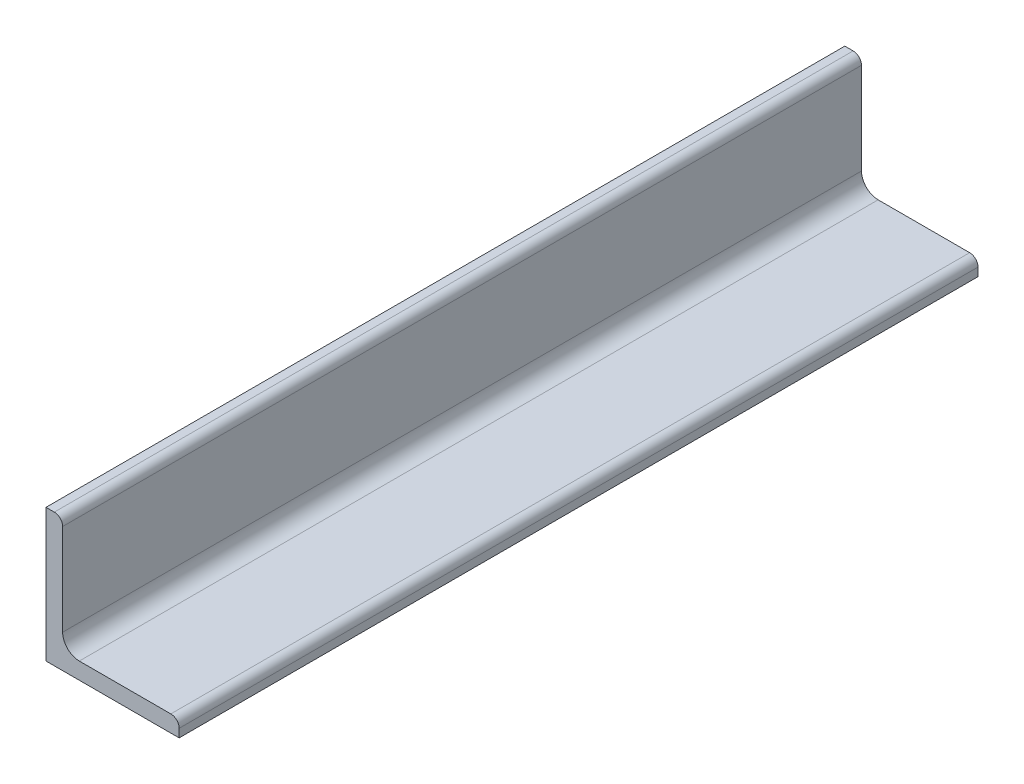
ISO-10303-21;
HEADER;
FILE_DESCRIPTION(('STEP AP214'),'2;1');
FILE_NAME('part.step','',(''),(''),'','','');
FILE_SCHEMA(('AUTOMOTIVE_DESIGN { 1 0 10303 214 1 1 1 1 }'));
ENDSEC;
DATA;
#1=APPLICATION_CONTEXT('core data for automotive mechanical design processes');
#2=APPLICATION_PROTOCOL_DEFINITION('international standard','automotive_design',2000,#1);
#3=PRODUCT_CONTEXT('',#1,'mechanical');
#4=PRODUCT('Part','Part','',(#3));
#5=PRODUCT_RELATED_PRODUCT_CATEGORY('part','',(#4));
#6=PRODUCT_DEFINITION_FORMATION('','',#4);
#7=PRODUCT_DEFINITION_CONTEXT('part definition',#1,'design');
#8=PRODUCT_DEFINITION('design','',#6,#7);
#9=PRODUCT_DEFINITION_SHAPE('','',#8);
#10=(LENGTH_UNIT() NAMED_UNIT(*) SI_UNIT(.MILLI.,.METRE.));
#11=(NAMED_UNIT(*) PLANE_ANGLE_UNIT() SI_UNIT($,.RADIAN.));
#12=(NAMED_UNIT(*) SI_UNIT($,.STERADIAN.) SOLID_ANGLE_UNIT());
#13=UNCERTAINTY_MEASURE_WITH_UNIT(LENGTH_MEASURE(1.E-05),#10,'distance_accuracy_value','');
#14=(GEOMETRIC_REPRESENTATION_CONTEXT(3) GLOBAL_UNCERTAINTY_ASSIGNED_CONTEXT((#13)) GLOBAL_UNIT_ASSIGNED_CONTEXT((#10,
#11,#12)) REPRESENTATION_CONTEXT('',''));
#15=CARTESIAN_POINT('',(0.,0.,0.));
#16=DIRECTION('',(0.,0.,1.));
#17=DIRECTION('',(1.,0.,0.));
#18=AXIS2_PLACEMENT_3D('',#15,#16,#17);
#19=CARTESIAN_POINT('',(0.116507760447575,51.418609434565,304.8));
#20=DIRECTION('',(1.,0.,0.));
#21=DIRECTION('',(0.,0.,-1.));
#22=AXIS2_PLACEMENT_3D('',#19,#20,#21);
#23=PLANE('',#22);
#24=DIRECTION('',(0.,-1.,0.));
#25=VECTOR('',#24,1.);
#26=CARTESIAN_POINT('',(0.116507760447575,51.418609434565,0.));
#27=LINE('',#26,#25);
#28=CARTESIAN_POINT('',(0.116507760447575,51.418609434565,0.));
#29=VERTEX_POINT('',#28);
#30=CARTESIAN_POINT('',(0.116507760447575,0.618609434565042,0.));
#31=VERTEX_POINT('',#30);
#32=EDGE_CURVE('E135',#29,#31,#27,.T.);
#33=ORIENTED_EDGE('',*,*,#32,.T.);
#34=DIRECTION('',(0.,0.,-1.));
#35=VECTOR('',#34,1.);
#36=CARTESIAN_POINT('',(0.116507760447575,0.618609434565042,304.8));
#37=LINE('',#36,#35);
#38=CARTESIAN_POINT('',(0.116507760447575,0.618609434565042,304.8));
#39=VERTEX_POINT('',#38);
#40=EDGE_CURVE('E11',#39,#31,#37,.T.);
#41=ORIENTED_EDGE('',*,*,#40,.F.);
#42=DIRECTION('',(0.,-1.,0.));
#43=VECTOR('',#42,1.);
#44=CARTESIAN_POINT('',(0.116507760447575,51.418609434565,304.8));
#45=LINE('',#44,#43);
#46=CARTESIAN_POINT('',(0.116507760447575,51.418609434565,304.8));
#47=VERTEX_POINT('',#46);
#48=EDGE_CURVE('E151',#47,#39,#45,.T.);
#49=ORIENTED_EDGE('',*,*,#48,.F.);
#50=DIRECTION('',(0.,0.,-1.));
#51=VECTOR('',#50,1.);
#52=CARTESIAN_POINT('',(0.116507760447575,51.418609434565,304.8));
#53=LINE('',#52,#51);
#54=EDGE_CURVE('E131',#47,#29,#53,.T.);
#55=ORIENTED_EDGE('',*,*,#54,.T.);
#56=EDGE_LOOP('',(#33,#41,#49,#55));
#57=FACE_BOUND('',#56,.T.);
#58=ADVANCED_FACE('F33',(#57),#23,.F.);
#59=CARTESIAN_POINT('',(0.116507760447575,0.618609434565042,304.8));
#60=DIRECTION('',(0.,1.,0.));
#61=DIRECTION('',(0.,0.,1.));
#62=AXIS2_PLACEMENT_3D('',#59,#60,#61);
#63=PLANE('',#62);
#64=DIRECTION('',(1.,0.,0.));
#65=VECTOR('',#64,1.);
#66=CARTESIAN_POINT('',(0.116507760447575,0.618609434565042,0.));
#67=LINE('',#66,#65);
#68=CARTESIAN_POINT('',(50.9165077604476,0.618609434565042,0.));
#69=VERTEX_POINT('',#68);
#70=EDGE_CURVE('E138',#31,#69,#67,.T.);
#71=ORIENTED_EDGE('',*,*,#70,.T.);
#72=DIRECTION('',(0.,0.,-1.));
#73=VECTOR('',#72,1.);
#74=CARTESIAN_POINT('',(50.9165077604476,0.618609434565042,304.8));
#75=LINE('',#74,#73);
#76=CARTESIAN_POINT('',(50.9165077604476,0.618609434565042,304.8));
#77=VERTEX_POINT('',#76);
#78=EDGE_CURVE('E41',#77,#69,#75,.T.);
#79=ORIENTED_EDGE('',*,*,#78,.F.);
#80=DIRECTION('',(1.,0.,0.));
#81=VECTOR('',#80,1.);
#82=CARTESIAN_POINT('',(0.116507760447575,0.618609434565042,304.8));
#83=LINE('',#82,#81);
#84=EDGE_CURVE('E95',#39,#77,#83,.T.);
#85=ORIENTED_EDGE('',*,*,#84,.F.);
#86=ORIENTED_EDGE('',*,*,#40,.T.);
#87=EDGE_LOOP('',(#71,#79,#85,#86));
#88=FACE_BOUND('',#87,.T.);
#89=ADVANCED_FACE('F194',(#88),#63,.F.);
#90=CARTESIAN_POINT('',(50.9165077604476,0.618609434565042,304.8));
#91=DIRECTION('',(-1.,0.,0.));
#92=DIRECTION('',(0.,0.,1.));
#93=AXIS2_PLACEMENT_3D('',#90,#91,#92);
#94=PLANE('',#93);
#95=DIRECTION('',(0.,1.,0.));
#96=VECTOR('',#95,1.);
#97=CARTESIAN_POINT('',(50.9165077604476,0.618609434565042,0.));
#98=LINE('',#97,#96);
#99=CARTESIAN_POINT('',(50.9165077604476,3.79360943456504,0.));
#100=VERTEX_POINT('',#99);
#101=EDGE_CURVE('E140',#69,#100,#98,.T.);
#102=ORIENTED_EDGE('',*,*,#101,.T.);
#103=DIRECTION('',(0.,0.,-1.));
#104=VECTOR('',#103,1.);
#105=CARTESIAN_POINT('',(50.9165077604476,3.79360943456504,304.8));
#106=LINE('',#105,#104);
#107=CARTESIAN_POINT('',(50.9165077604476,3.79360943456504,304.8));
#108=VERTEX_POINT('',#107);
#109=EDGE_CURVE('E161',#108,#100,#106,.T.);
#110=ORIENTED_EDGE('',*,*,#109,.F.);
#111=DIRECTION('',(0.,1.,0.));
#112=VECTOR('',#111,1.);
#113=CARTESIAN_POINT('',(50.9165077604476,0.618609434565042,304.8));
#114=LINE('',#113,#112);
#115=EDGE_CURVE('E169',#77,#108,#114,.T.);
#116=ORIENTED_EDGE('',*,*,#115,.F.);
#117=ORIENTED_EDGE('',*,*,#78,.T.);
#118=EDGE_LOOP('',(#102,#110,#116,#117));
#119=FACE_BOUND('',#118,.T.);
#120=ADVANCED_FACE('F167',(#119),#94,.F.);
#121=CARTESIAN_POINT('',(47.7415077604476,3.79360943456504,304.8));
#122=DIRECTION('',(0.,0.,-1.));
#123=DIRECTION('',(-1.,0.,0.));
#124=AXIS2_PLACEMENT_3D('',#121,#122,#123);
#125=CYLINDRICAL_SURFACE('',#124,3.175);
#126=CARTESIAN_POINT('',(47.7415077604476,3.79360943456504,0.));
#127=DIRECTION('',(0.,0.,1.));
#128=DIRECTION('',(1.,0.,0.));
#129=AXIS2_PLACEMENT_3D('',#126,#127,#128);
#130=CIRCLE('',#129,3.175);
#131=CARTESIAN_POINT('',(47.7415077604476,6.96860943456504,0.));
#132=VERTEX_POINT('',#131);
#133=EDGE_CURVE('E142',#100,#132,#130,.T.);
#134=ORIENTED_EDGE('',*,*,#133,.T.);
#135=DIRECTION('',(0.,0.,-1.));
#136=VECTOR('',#135,1.);
#137=CARTESIAN_POINT('',(47.7415077604476,6.96860943456504,304.8));
#138=LINE('',#137,#136);
#139=CARTESIAN_POINT('',(47.7415077604476,6.96860943456504,304.8));
#140=VERTEX_POINT('',#139);
#141=EDGE_CURVE('E158',#140,#132,#138,.T.);
#142=ORIENTED_EDGE('',*,*,#141,.F.);
#143=CARTESIAN_POINT('',(47.7415077604476,3.79360943456504,304.8));
#144=DIRECTION('',(0.,0.,1.));
#145=DIRECTION('',(1.,0.,0.));
#146=AXIS2_PLACEMENT_3D('',#143,#144,#145);
#147=CIRCLE('',#146,3.175);
#148=EDGE_CURVE('E185',#108,#140,#147,.T.);
#149=ORIENTED_EDGE('',*,*,#148,.F.);
#150=ORIENTED_EDGE('',*,*,#109,.T.);
#151=EDGE_LOOP('',(#134,#142,#149,#150));
#152=FACE_BOUND('',#151,.T.);
#153=ADVANCED_FACE('F178',(#152),#125,.T.);
#154=CARTESIAN_POINT('',(47.7415077604476,6.96860943456504,304.8));
#155=DIRECTION('',(0.,-1.,0.));
#156=DIRECTION('',(0.,0.,-1.));
#157=AXIS2_PLACEMENT_3D('',#154,#155,#156);
#158=PLANE('',#157);
#159=DIRECTION('',(-1.,0.,0.));
#160=VECTOR('',#159,1.);
#161=CARTESIAN_POINT('',(47.7415077604476,6.96860943456504,0.));
#162=LINE('',#161,#160);
#163=CARTESIAN_POINT('',(12.8165077604476,6.96860943456504,0.));
#164=VERTEX_POINT('',#163);
#165=EDGE_CURVE('E144',#132,#164,#162,.T.);
#166=ORIENTED_EDGE('',*,*,#165,.T.);
#167=DIRECTION('',(0.,0.,-1.));
#168=VECTOR('',#167,1.);
#169=CARTESIAN_POINT('',(12.8165077604476,6.96860943456504,304.8));
#170=LINE('',#169,#168);
#171=CARTESIAN_POINT('',(12.8165077604476,6.96860943456504,304.8));
#172=VERTEX_POINT('',#171);
#173=EDGE_CURVE('E155',#172,#164,#170,.T.);
#174=ORIENTED_EDGE('',*,*,#173,.F.);
#175=DIRECTION('',(-1.,0.,0.));
#176=VECTOR('',#175,1.);
#177=CARTESIAN_POINT('',(47.7415077604476,6.96860943456504,304.8));
#178=LINE('',#177,#176);
#179=EDGE_CURVE('E184',#140,#172,#178,.T.);
#180=ORIENTED_EDGE('',*,*,#179,.F.);
#181=ORIENTED_EDGE('',*,*,#141,.T.);
#182=EDGE_LOOP('',(#166,#174,#180,#181));
#183=FACE_BOUND('',#182,.T.);
#184=ADVANCED_FACE('F182',(#183),#158,.F.);
#185=CARTESIAN_POINT('',(12.8165077604476,13.318609434565,304.8));
#186=DIRECTION('',(0.,0.,-1.));
#187=DIRECTION('',(-1.,0.,0.));
#188=AXIS2_PLACEMENT_3D('',#185,#186,#187);
#189=CYLINDRICAL_SURFACE('',#188,6.34999999999999);
#190=CARTESIAN_POINT('',(12.8165077604476,13.318609434565,0.));
#191=DIRECTION('',(0.,0.,-1.));
#192=DIRECTION('',(1.,0.,0.));
#193=AXIS2_PLACEMENT_3D('',#190,#191,#192);
#194=CIRCLE('',#193,6.34999999999999);
#195=CARTESIAN_POINT('',(6.46650776044758,13.318609434565,0.));
#196=VERTEX_POINT('',#195);
#197=EDGE_CURVE('E146',#164,#196,#194,.T.);
#198=ORIENTED_EDGE('',*,*,#197,.T.);
#199=DIRECTION('',(0.,0.,-1.));
#200=VECTOR('',#199,1.);
#201=CARTESIAN_POINT('',(6.46650776044758,13.318609434565,304.8));
#202=LINE('',#201,#200);
#203=CARTESIAN_POINT('',(6.46650776044758,13.318609434565,304.8));
#204=VERTEX_POINT('',#203);
#205=EDGE_CURVE('E126',#204,#196,#202,.T.);
#206=ORIENTED_EDGE('',*,*,#205,.F.);
#207=CARTESIAN_POINT('',(12.8165077604476,13.318609434565,304.8));
#208=DIRECTION('',(0.,0.,-1.));
#209=DIRECTION('',(1.,0.,0.));
#210=AXIS2_PLACEMENT_3D('',#207,#208,#209);
#211=CIRCLE('',#210,6.34999999999999);
#212=EDGE_CURVE('E117',#172,#204,#211,.T.);
#213=ORIENTED_EDGE('',*,*,#212,.F.);
#214=ORIENTED_EDGE('',*,*,#173,.T.);
#215=EDGE_LOOP('',(#198,#206,#213,#214));
#216=FACE_BOUND('',#215,.T.);
#217=ADVANCED_FACE('F206',(#216),#189,.F.);
#218=CARTESIAN_POINT('',(6.46650776044757,13.318609434565,304.8));
#219=DIRECTION('',(-1.,0.,0.));
#220=DIRECTION('',(0.,0.,1.));
#221=AXIS2_PLACEMENT_3D('',#218,#219,#220);
#222=PLANE('',#221);
#223=DIRECTION('',(0.,1.,0.));
#224=VECTOR('',#223,1.);
#225=CARTESIAN_POINT('',(6.46650776044757,13.318609434565,0.));
#226=LINE('',#225,#224);
#227=CARTESIAN_POINT('',(6.46650776044757,48.243609434565,0.));
#228=VERTEX_POINT('',#227);
#229=EDGE_CURVE('E125',#196,#228,#226,.T.);
#230=ORIENTED_EDGE('',*,*,#229,.T.);
#231=DIRECTION('',(0.,0.,-1.));
#232=VECTOR('',#231,1.);
#233=CARTESIAN_POINT('',(6.46650776044757,48.243609434565,304.8));
#234=LINE('',#233,#232);
#235=CARTESIAN_POINT('',(6.46650776044757,48.243609434565,304.8));
#236=VERTEX_POINT('',#235);
#237=EDGE_CURVE('E122',#236,#228,#234,.T.);
#238=ORIENTED_EDGE('',*,*,#237,.F.);
#239=DIRECTION('',(0.,1.,0.));
#240=VECTOR('',#239,1.);
#241=CARTESIAN_POINT('',(6.46650776044757,13.318609434565,304.8));
#242=LINE('',#241,#240);
#243=EDGE_CURVE('E111',#204,#236,#242,.T.);
#244=ORIENTED_EDGE('',*,*,#243,.F.);
#245=ORIENTED_EDGE('',*,*,#205,.T.);
#246=EDGE_LOOP('',(#230,#238,#244,#245));
#247=FACE_BOUND('',#246,.T.);
#248=ADVANCED_FACE('F123',(#247),#222,.F.);
#249=CARTESIAN_POINT('',(3.29150776044757,48.243609434565,304.8));
#250=DIRECTION('',(0.,0.,-1.));
#251=DIRECTION('',(-1.,0.,0.));
#252=AXIS2_PLACEMENT_3D('',#249,#250,#251);
#253=CYLINDRICAL_SURFACE('',#252,3.175);
#254=CARTESIAN_POINT('',(3.29150776044757,48.243609434565,0.));
#255=DIRECTION('',(0.,0.,1.));
#256=DIRECTION('',(1.,0.,0.));
#257=AXIS2_PLACEMENT_3D('',#254,#255,#256);
#258=CIRCLE('',#257,3.175);
#259=CARTESIAN_POINT('',(3.29150776044758,51.418609434565,0.));
#260=VERTEX_POINT('',#259);
#261=EDGE_CURVE('E81',#228,#260,#258,.T.);
#262=ORIENTED_EDGE('',*,*,#261,.T.);
#263=DIRECTION('',(0.,0.,-1.));
#264=VECTOR('',#263,1.);
#265=CARTESIAN_POINT('',(3.29150776044758,51.418609434565,304.8));
#266=LINE('',#265,#264);
#267=CARTESIAN_POINT('',(3.29150776044758,51.418609434565,304.8));
#268=VERTEX_POINT('',#267);
#269=EDGE_CURVE('E127',#268,#260,#266,.T.);
#270=ORIENTED_EDGE('',*,*,#269,.F.);
#271=CARTESIAN_POINT('',(3.29150776044757,48.243609434565,304.8));
#272=DIRECTION('',(0.,0.,1.));
#273=DIRECTION('',(1.,0.,0.));
#274=AXIS2_PLACEMENT_3D('',#271,#272,#273);
#275=CIRCLE('',#274,3.175);
#276=EDGE_CURVE('E115',#236,#268,#275,.T.);
#277=ORIENTED_EDGE('',*,*,#276,.F.);
#278=ORIENTED_EDGE('',*,*,#237,.T.);
#279=EDGE_LOOP('',(#262,#270,#277,#278));
#280=FACE_BOUND('',#279,.T.);
#281=ADVANCED_FACE('F129',(#280),#253,.T.);
#282=CARTESIAN_POINT('',(3.29150776044758,51.418609434565,304.8));
#283=DIRECTION('',(0.,-1.,0.));
#284=DIRECTION('',(0.,0.,-1.));
#285=AXIS2_PLACEMENT_3D('',#282,#283,#284);
#286=PLANE('',#285);
#287=DIRECTION('',(-1.,0.,0.));
#288=VECTOR('',#287,1.);
#289=CARTESIAN_POINT('',(3.29150776044758,51.418609434565,0.));
#290=LINE('',#289,#288);
#291=EDGE_CURVE('E87',#260,#29,#290,.T.);
#292=ORIENTED_EDGE('',*,*,#291,.T.);
#293=ORIENTED_EDGE('',*,*,#54,.F.);
#294=DIRECTION('',(-1.,0.,0.));
#295=VECTOR('',#294,1.);
#296=CARTESIAN_POINT('',(3.29150776044758,51.418609434565,304.8));
#297=LINE('',#296,#295);
#298=EDGE_CURVE('E49',#268,#47,#297,.T.);
#299=ORIENTED_EDGE('',*,*,#298,.F.);
#300=ORIENTED_EDGE('',*,*,#269,.T.);
#301=EDGE_LOOP('',(#292,#293,#299,#300));
#302=FACE_BOUND('',#301,.T.);
#303=ADVANCED_FACE('F214',(#302),#286,.F.);
#304=CARTESIAN_POINT('',(47.7415077604476,3.79360943456504,304.8));
#305=DIRECTION('',(0.,0.,1.));
#306=DIRECTION('',(1.,0.,0.));
#307=AXIS2_PLACEMENT_3D('',#304,#305,#306);
#308=PLANE('',#307);
#309=ORIENTED_EDGE('',*,*,#48,.T.);
#310=ORIENTED_EDGE('',*,*,#84,.T.);
#311=ORIENTED_EDGE('',*,*,#115,.T.);
#312=ORIENTED_EDGE('',*,*,#148,.T.);
#313=ORIENTED_EDGE('',*,*,#179,.T.);
#314=ORIENTED_EDGE('',*,*,#212,.T.);
#315=ORIENTED_EDGE('',*,*,#243,.T.);
#316=ORIENTED_EDGE('',*,*,#276,.T.);
#317=ORIENTED_EDGE('',*,*,#298,.T.);
#318=EDGE_LOOP('',(#309,#310,#311,#312,#313,#314,#315,#316,#317));
#319=FACE_BOUND('',#318,.T.);
#320=ADVANCED_FACE('F113',(#319),#308,.T.);
#321=CARTESIAN_POINT('',(47.7415077604476,3.79360943456504,0.));
#322=DIRECTION('',(0.,0.,1.));
#323=DIRECTION('',(1.,0.,0.));
#324=AXIS2_PLACEMENT_3D('',#321,#322,#323);
#325=PLANE('',#324);
#326=ORIENTED_EDGE('',*,*,#32,.F.);
#327=ORIENTED_EDGE('',*,*,#291,.F.);
#328=ORIENTED_EDGE('',*,*,#261,.F.);
#329=ORIENTED_EDGE('',*,*,#229,.F.);
#330=ORIENTED_EDGE('',*,*,#197,.F.);
#331=ORIENTED_EDGE('',*,*,#165,.F.);
#332=ORIENTED_EDGE('',*,*,#133,.F.);
#333=ORIENTED_EDGE('',*,*,#101,.F.);
#334=ORIENTED_EDGE('',*,*,#70,.F.);
#335=EDGE_LOOP('',(#326,#327,#328,#329,#330,#331,#332,#333,#334));
#336=FACE_BOUND('',#335,.T.);
#337=ADVANCED_FACE('F173',(#336),#325,.F.);
#338=CLOSED_SHELL('',(#58,#89,#120,#153,#184,#217,#248,#281,#303,#320,#337));
#339=MANIFOLD_SOLID_BREP('B2',#338);
#340=ADVANCED_BREP_SHAPE_REPRESENTATION('',(#18,#339),#14);
#341=SHAPE_DEFINITION_REPRESENTATION(#9,#340);
ENDSEC;
END-ISO-10303-21;
